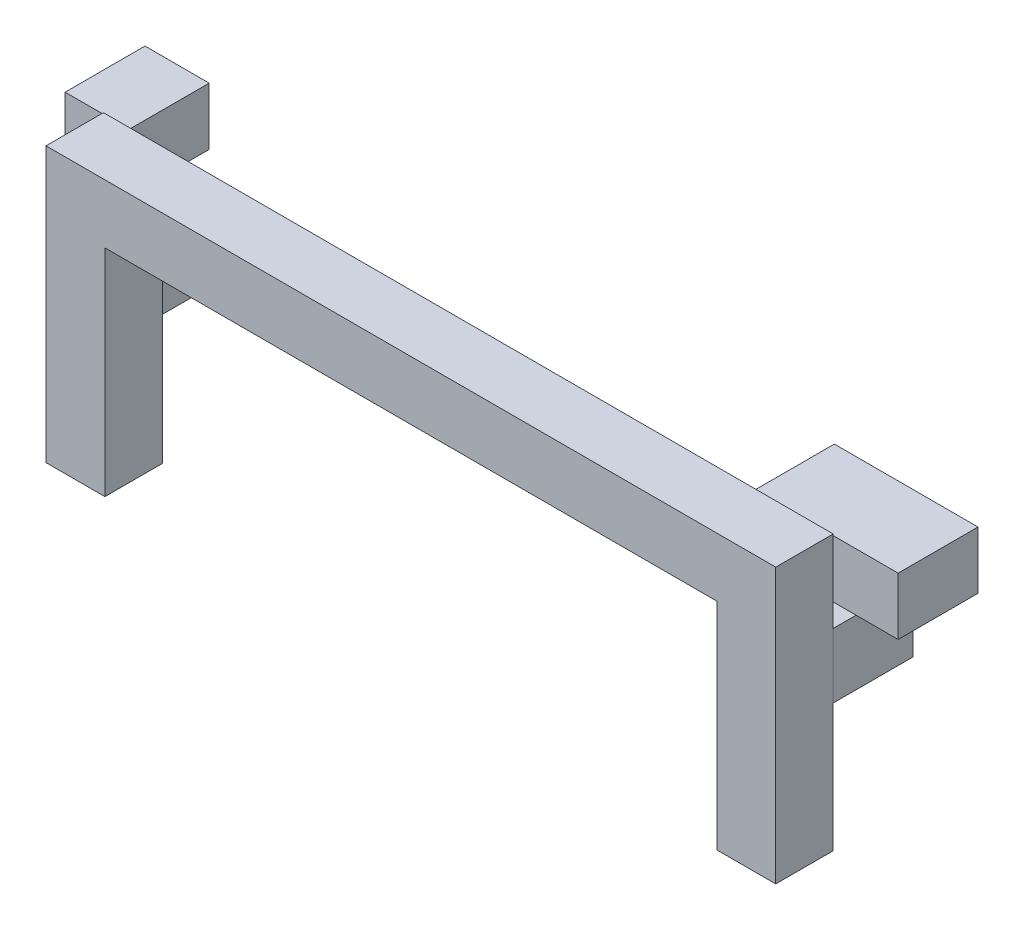
ISO-10303-21;
HEADER;
FILE_DESCRIPTION(('STEP AP214'),'2;1');
FILE_NAME('part.step','',(''),(''),'','','');
FILE_SCHEMA(('AUTOMOTIVE_DESIGN { 1 0 10303 214 1 1 1 1 }'));
ENDSEC;
DATA;
#1=APPLICATION_CONTEXT('core data for automotive mechanical design processes');
#2=APPLICATION_PROTOCOL_DEFINITION('international standard','automotive_design',2000,#1);
#3=PRODUCT_CONTEXT('',#1,'mechanical');
#4=PRODUCT('Part','Part','',(#3));
#5=PRODUCT_RELATED_PRODUCT_CATEGORY('part','',(#4));
#6=PRODUCT_DEFINITION_FORMATION('','',#4);
#7=PRODUCT_DEFINITION_CONTEXT('part definition',#1,'design');
#8=PRODUCT_DEFINITION('design','',#6,#7);
#9=PRODUCT_DEFINITION_SHAPE('','',#8);
#10=(LENGTH_UNIT() NAMED_UNIT(*) SI_UNIT(.MILLI.,.METRE.));
#11=(NAMED_UNIT(*) PLANE_ANGLE_UNIT() SI_UNIT($,.RADIAN.));
#12=(NAMED_UNIT(*) SI_UNIT($,.STERADIAN.) SOLID_ANGLE_UNIT());
#13=UNCERTAINTY_MEASURE_WITH_UNIT(LENGTH_MEASURE(1.E-05),#10,'distance_accuracy_value','');
#14=(GEOMETRIC_REPRESENTATION_CONTEXT(3) GLOBAL_UNCERTAINTY_ASSIGNED_CONTEXT((#13)) GLOBAL_UNIT_ASSIGNED_CONTEXT((#10,
#11,#12)) REPRESENTATION_CONTEXT('',''));
#15=CARTESIAN_POINT('',(0.,0.,0.));
#16=DIRECTION('',(0.,0.,1.));
#17=DIRECTION('',(1.,0.,0.));
#18=AXIS2_PLACEMENT_3D('',#15,#16,#17);
#19=CARTESIAN_POINT('',(0.,0.,0.));
#20=DIRECTION('',(0.,0.,1.));
#21=DIRECTION('',(1.,0.,0.));
#22=AXIS2_PLACEMENT_3D('',#19,#20,#21);
#23=PLANE('',#22);
#24=DIRECTION('',(0.,1.,0.));
#25=VECTOR('',#24,1.);
#26=CARTESIAN_POINT('',(84.4643859649122,-11.0964912280702,0.));
#27=LINE('',#26,#25);
#28=CARTESIAN_POINT('',(84.4643859649122,-51.0964912280702,0.));
#29=VERTEX_POINT('',#28);
#30=CARTESIAN_POINT('',(84.4643859649122,-11.0964912280702,0.));
#31=VERTEX_POINT('',#30);
#32=EDGE_CURVE('E356',#29,#31,#27,.T.);
#33=ORIENTED_EDGE('',*,*,#32,.F.);
#34=DIRECTION('',(1.,0.,0.));
#35=VECTOR('',#34,1.);
#36=CARTESIAN_POINT('',(0.,-51.0964912280702,0.));
#37=LINE('',#36,#35);
#38=CARTESIAN_POINT('',(-327.745614035088,-51.0964912280702,0.));
#39=VERTEX_POINT('',#38);
#40=EDGE_CURVE('E418',#39,#29,#37,.T.);
#41=ORIENTED_EDGE('',*,*,#40,.F.);
#42=DIRECTION('',(0.,1.,0.));
#43=VECTOR('',#42,1.);
#44=CARTESIAN_POINT('',(-327.745614035088,-201.09649122807,0.));
#45=LINE('',#44,#43);
#46=CARTESIAN_POINT('',(-327.745614035088,-201.09649122807,0.));
#47=VERTEX_POINT('',#46);
#48=EDGE_CURVE('E311',#47,#39,#45,.T.);
#49=ORIENTED_EDGE('',*,*,#48,.F.);
#50=DIRECTION('',(1.,0.,0.));
#51=VECTOR('',#50,1.);
#52=CARTESIAN_POINT('',(-368.745614035088,-201.09649122807,0.));
#53=LINE('',#52,#51);
#54=CARTESIAN_POINT('',(-368.745614035088,-201.09649122807,0.));
#55=VERTEX_POINT('',#54);
#56=EDGE_CURVE('E298',#55,#47,#53,.T.);
#57=ORIENTED_EDGE('',*,*,#56,.F.);
#58=DIRECTION('',(0.,1.,0.));
#59=VECTOR('',#58,1.);
#60=CARTESIAN_POINT('',(-368.745614035088,-201.09649122807,0.));
#61=LINE('',#60,#59);
#62=CARTESIAN_POINT('',(-368.745614035088,-51.0964912280702,0.));
#63=VERTEX_POINT('',#62);
#64=EDGE_CURVE('E313',#55,#63,#61,.T.);
#65=ORIENTED_EDGE('',*,*,#64,.T.);
#66=DIRECTION('',(1.,0.,0.));
#67=VECTOR('',#66,1.);
#68=CARTESIAN_POINT('',(-368.745614035088,-51.0964912280702,0.));
#69=LINE('',#68,#67);
#70=CARTESIAN_POINT('',(-350.745614035088,-51.0964912280702,0.));
#71=VERTEX_POINT('',#70);
#72=EDGE_CURVE('E294',#63,#71,#69,.T.);
#73=ORIENTED_EDGE('',*,*,#72,.T.);
#74=DIRECTION('',(0.,1.,0.));
#75=VECTOR('',#74,1.);
#76=CARTESIAN_POINT('',(-350.745614035088,-51.0964912280702,0.));
#77=LINE('',#76,#75);
#78=CARTESIAN_POINT('',(-350.745614035088,-11.0964912280702,0.));
#79=VERTEX_POINT('',#78);
#80=EDGE_CURVE('E373',#71,#79,#77,.T.);
#81=ORIENTED_EDGE('',*,*,#80,.T.);
#82=DIRECTION('',(1.,0.,0.));
#83=VECTOR('',#82,1.);
#84=CARTESIAN_POINT('',(0.,-11.0964912280702,0.));
#85=LINE('',#84,#83);
#86=CARTESIAN_POINT('',(-368.745614035088,-11.0964912280702,0.));
#87=VERTEX_POINT('',#86);
#88=EDGE_CURVE('E12',#87,#79,#85,.T.);
#89=ORIENTED_EDGE('',*,*,#88,.F.);
#90=DIRECTION('',(0.,-1.,0.));
#91=VECTOR('',#90,1.);
#92=CARTESIAN_POINT('',(-368.745614035088,0.,0.));
#93=LINE('',#92,#91);
#94=CARTESIAN_POINT('',(-368.745614035088,-10.0964912280702,0.));
#95=VERTEX_POINT('',#94);
#96=EDGE_CURVE('E415',#95,#87,#93,.T.);
#97=ORIENTED_EDGE('',*,*,#96,.F.);
#98=DIRECTION('',(1.,0.,0.));
#99=VECTOR('',#98,1.);
#100=CARTESIAN_POINT('',(0.,-10.0964912280702,0.));
#101=LINE('',#100,#99);
#102=CARTESIAN_POINT('',(139.254385964912,-10.0964912280702,0.));
#103=VERTEX_POINT('',#102);
#104=EDGE_CURVE('E407',#95,#103,#101,.T.);
#105=ORIENTED_EDGE('',*,*,#104,.T.);
#106=DIRECTION('',(0.,-1.,0.));
#107=VECTOR('',#106,1.);
#108=CARTESIAN_POINT('',(139.254385964912,0.,0.));
#109=LINE('',#108,#107);
#110=CARTESIAN_POINT('',(139.254385964912,-11.0964912280702,0.));
#111=VERTEX_POINT('',#110);
#112=EDGE_CURVE('E421',#103,#111,#109,.T.);
#113=ORIENTED_EDGE('',*,*,#112,.T.);
#114=DIRECTION('',(1.,0.,0.));
#115=VECTOR('',#114,1.);
#116=CARTESIAN_POINT('',(184.464385964912,-11.0964912280702,0.));
#117=LINE('',#116,#115);
#118=EDGE_CURVE('E344',#31,#111,#117,.T.);
#119=ORIENTED_EDGE('',*,*,#118,.F.);
#120=EDGE_LOOP('',(#33,#41,#49,#57,#65,#73,#81,#89,#97,#105,#113,#119));
#121=FACE_BOUND('',#120,.T.);
#122=DIRECTION('',(0.,-1.,0.));
#123=VECTOR('',#122,1.);
#124=CARTESIAN_POINT('',(-328.645614035088,-67.1420576980702,0.));
#125=LINE('',#124,#123);
#126=CARTESIAN_POINT('',(-328.645614035088,-67.1420576980702,0.));
#127=VERTEX_POINT('',#126);
#128=CARTESIAN_POINT('',(-328.645614035088,-112.14205769807,0.));
#129=VERTEX_POINT('',#128);
#130=EDGE_CURVE('E255',#127,#129,#125,.T.);
#131=ORIENTED_EDGE('',*,*,#130,.F.);
#132=DIRECTION('',(1.,0.,0.));
#133=VECTOR('',#132,1.);
#134=CARTESIAN_POINT('',(-328.645614035088,-67.1420576980702,0.));
#135=LINE('',#134,#133);
#136=CARTESIAN_POINT('',(-368.645614035088,-67.1420576980702,0.));
#137=VERTEX_POINT('',#136);
#138=EDGE_CURVE('E252',#137,#127,#135,.T.);
#139=ORIENTED_EDGE('',*,*,#138,.F.);
#140=DIRECTION('',(0.,1.,0.));
#141=VECTOR('',#140,1.);
#142=CARTESIAN_POINT('',(-368.645614035088,-67.1420576980702,0.));
#143=LINE('',#142,#141);
#144=CARTESIAN_POINT('',(-368.645614035088,-112.14205769807,0.));
#145=VERTEX_POINT('',#144);
#146=EDGE_CURVE('E82',#145,#137,#143,.T.);
#147=ORIENTED_EDGE('',*,*,#146,.F.);
#148=DIRECTION('',(-1.,0.,0.));
#149=VECTOR('',#148,1.);
#150=CARTESIAN_POINT('',(-328.645614035088,-112.14205769807,0.));
#151=LINE('',#150,#149);
#152=EDGE_CURVE('E77',#129,#145,#151,.T.);
#153=ORIENTED_EDGE('',*,*,#152,.F.);
#154=EDGE_LOOP('',(#131,#139,#147,#153));
#155=FACE_BOUND('',#154,.T.);
#156=ADVANCED_FACE('F60',(#121,#155),#23,.F.);
#157=CARTESIAN_POINT('',(139.254385964912,-201.09649122807,0.));
#158=DIRECTION('',(0.,0.,1.));
#159=DIRECTION('',(1.,0.,0.));
#160=AXIS2_PLACEMENT_3D('',#157,#158,#159);
#161=PLANE('',#160);
#162=DIRECTION('',(1.,0.,0.));
#163=VECTOR('',#162,1.);
#164=CARTESIAN_POINT('',(139.254385964912,-51.0964912280702,0.));
#165=LINE('',#164,#163);
#166=CARTESIAN_POINT('',(98.2543859649123,-51.0964912280702,0.));
#167=VERTEX_POINT('',#166);
#168=CARTESIAN_POINT('',(139.254385964912,-51.0964912280702,0.));
#169=VERTEX_POINT('',#168);
#170=EDGE_CURVE('E320',#167,#169,#165,.T.);
#171=ORIENTED_EDGE('',*,*,#170,.T.);
#172=DIRECTION('',(0.,1.,0.));
#173=VECTOR('',#172,1.);
#174=CARTESIAN_POINT('',(139.254385964912,-201.09649122807,0.));
#175=LINE('',#174,#173);
#176=CARTESIAN_POINT('',(139.254385964912,-201.09649122807,0.));
#177=VERTEX_POINT('',#176);
#178=EDGE_CURVE('E326',#177,#169,#175,.T.);
#179=ORIENTED_EDGE('',*,*,#178,.F.);
#180=DIRECTION('',(1.,0.,0.));
#181=VECTOR('',#180,1.);
#182=CARTESIAN_POINT('',(139.254385964912,-201.09649122807,0.));
#183=LINE('',#182,#181);
#184=CARTESIAN_POINT('',(98.2543859649123,-201.09649122807,0.));
#185=VERTEX_POINT('',#184);
#186=EDGE_CURVE('E324',#185,#177,#183,.T.);
#187=ORIENTED_EDGE('',*,*,#186,.F.);
#188=DIRECTION('',(0.,1.,0.));
#189=VECTOR('',#188,1.);
#190=CARTESIAN_POINT('',(98.2543859649123,-201.09649122807,0.));
#191=LINE('',#190,#189);
#192=EDGE_CURVE('E333',#185,#167,#191,.T.);
#193=ORIENTED_EDGE('',*,*,#192,.T.);
#194=EDGE_LOOP('',(#171,#179,#187,#193));
#195=FACE_BOUND('',#194,.T.);
#196=DIRECTION('',(0.,-1.,0.));
#197=VECTOR('',#196,1.);
#198=CARTESIAN_POINT('',(139.154385964912,-67.1420576980702,0.));
#199=LINE('',#198,#197);
#200=CARTESIAN_POINT('',(139.154385964912,-67.1420576980702,0.));
#201=VERTEX_POINT('',#200);
#202=CARTESIAN_POINT('',(139.154385964912,-112.14205769807,0.));
#203=VERTEX_POINT('',#202);
#204=EDGE_CURVE('E256',#201,#203,#199,.T.);
#205=ORIENTED_EDGE('',*,*,#204,.F.);
#206=DIRECTION('',(1.,0.,0.));
#207=VECTOR('',#206,1.);
#208=CARTESIAN_POINT('',(139.154385964912,-67.1420576980702,0.));
#209=LINE('',#208,#207);
#210=CARTESIAN_POINT('',(99.1543859649123,-67.1420576980702,0.));
#211=VERTEX_POINT('',#210);
#212=EDGE_CURVE('E269',#211,#201,#209,.T.);
#213=ORIENTED_EDGE('',*,*,#212,.F.);
#214=DIRECTION('',(0.,1.,0.));
#215=VECTOR('',#214,1.);
#216=CARTESIAN_POINT('',(99.1543859649123,-67.1420576980702,0.));
#217=LINE('',#216,#215);
#218=CARTESIAN_POINT('',(99.1543859649123,-112.14205769807,0.));
#219=VERTEX_POINT('',#218);
#220=EDGE_CURVE('E278',#219,#211,#217,.T.);
#221=ORIENTED_EDGE('',*,*,#220,.F.);
#222=DIRECTION('',(-1.,0.,0.));
#223=VECTOR('',#222,1.);
#224=CARTESIAN_POINT('',(139.154385964912,-112.14205769807,0.));
#225=LINE('',#224,#223);
#226=EDGE_CURVE('E259',#203,#219,#225,.T.);
#227=ORIENTED_EDGE('',*,*,#226,.F.);
#228=EDGE_LOOP('',(#205,#213,#221,#227));
#229=FACE_BOUND('',#228,.T.);
#230=ADVANCED_FACE('F477',(#195,#229),#161,.F.);
#231=CARTESIAN_POINT('',(0.,-51.0964912280702,40.));
#232=DIRECTION('',(0.,1.,0.));
#233=DIRECTION('',(0.,0.,1.));
#234=AXIS2_PLACEMENT_3D('',#231,#232,#233);
#235=PLANE('',#234);
#236=ORIENTED_EDGE('',*,*,#72,.F.);
#237=DIRECTION('',(1.,0.,0.));
#238=VECTOR('',#237,1.);
#239=CARTESIAN_POINT('',(0.,-51.0964912280702,0.));
#240=LINE('',#239,#238);
#241=CARTESIAN_POINT('',(-395.435614035088,-51.0964912280702,0.));
#242=VERTEX_POINT('',#241);
#243=EDGE_CURVE('E378',#242,#63,#240,.T.);
#244=ORIENTED_EDGE('',*,*,#243,.F.);
#245=DIRECTION('',(0.,0.,1.));
#246=VECTOR('',#245,1.);
#247=CARTESIAN_POINT('',(-395.435614035088,-51.0964912280702,-55.6));
#248=LINE('',#247,#246);
#249=CARTESIAN_POINT('',(-395.435614035088,-51.0964912280702,-55.6));
#250=VERTEX_POINT('',#249);
#251=EDGE_CURVE('E382',#250,#242,#248,.T.);
#252=ORIENTED_EDGE('',*,*,#251,.F.);
#253=DIRECTION('',(1.,0.,0.));
#254=VECTOR('',#253,1.);
#255=CARTESIAN_POINT('',(0.,-51.0964912280702,-55.6));
#256=LINE('',#255,#254);
#257=CARTESIAN_POINT('',(-350.745614035088,-51.0964912280702,-55.6));
#258=VERTEX_POINT('',#257);
#259=EDGE_CURVE('E380',#250,#258,#256,.T.);
#260=ORIENTED_EDGE('',*,*,#259,.T.);
#261=DIRECTION('',(0.,0.,1.));
#262=VECTOR('',#261,1.);
#263=CARTESIAN_POINT('',(-350.745614035088,-51.0964912280702,-55.6));
#264=LINE('',#263,#262);
#265=EDGE_CURVE('E398',#258,#71,#264,.T.);
#266=ORIENTED_EDGE('',*,*,#265,.T.);
#267=EDGE_LOOP('',(#236,#244,#252,#260,#266));
#268=FACE_BOUND('',#267,.T.);
#269=ADVANCED_FACE('F455',(#268),#235,.F.);
#270=DIRECTION('',(0.,0.,1.));
#271=VECTOR('',#270,1.);
#272=CARTESIAN_POINT('',(-327.745614035088,-51.0964912280702,0.));
#273=LINE('',#272,#271);
#274=CARTESIAN_POINT('',(-327.745614035088,-51.0964912280702,40.));
#275=VERTEX_POINT('',#274);
#276=EDGE_CURVE('E299',#39,#275,#273,.T.);
#277=ORIENTED_EDGE('',*,*,#276,.F.);
#278=ORIENTED_EDGE('',*,*,#40,.T.);
#279=DIRECTION('',(0.,0.,1.));
#280=VECTOR('',#279,1.);
#281=CARTESIAN_POINT('',(84.4643859649122,-51.0964912280702,-55.6));
#282=LINE('',#281,#280);
#283=CARTESIAN_POINT('',(84.4643859649122,-51.0964912280702,-55.6));
#284=VERTEX_POINT('',#283);
#285=EDGE_CURVE('E367',#284,#29,#282,.T.);
#286=ORIENTED_EDGE('',*,*,#285,.F.);
#287=DIRECTION('',(-1.,0.,0.));
#288=VECTOR('',#287,1.);
#289=CARTESIAN_POINT('',(184.464385964912,-51.0964912280702,-55.6));
#290=LINE('',#289,#288);
#291=CARTESIAN_POINT('',(184.464385964912,-51.0964912280702,-55.6));
#292=VERTEX_POINT('',#291);
#293=EDGE_CURVE('E343',#292,#284,#290,.T.);
#294=ORIENTED_EDGE('',*,*,#293,.F.);
#295=DIRECTION('',(0.,0.,1.));
#296=VECTOR('',#295,1.);
#297=CARTESIAN_POINT('',(184.464385964912,-51.0964912280702,-55.6));
#298=LINE('',#297,#296);
#299=CARTESIAN_POINT('',(184.464385964912,-51.0964912280702,0.));
#300=VERTEX_POINT('',#299);
#301=EDGE_CURVE('E370',#292,#300,#298,.T.);
#302=ORIENTED_EDGE('',*,*,#301,.T.);
#303=DIRECTION('',(-1.,0.,0.));
#304=VECTOR('',#303,1.);
#305=CARTESIAN_POINT('',(184.464385964912,-51.0964912280702,0.));
#306=LINE('',#305,#304);
#307=EDGE_CURVE('E353',#300,#169,#306,.T.);
#308=ORIENTED_EDGE('',*,*,#307,.T.);
#309=ORIENTED_EDGE('',*,*,#170,.F.);
#310=DIRECTION('',(0.,0.,-1.));
#311=VECTOR('',#310,1.);
#312=CARTESIAN_POINT('',(98.2543859649123,-51.0964912280702,0.));
#313=LINE('',#312,#311);
#314=CARTESIAN_POINT('',(98.2543859649123,-51.0964912280702,40.));
#315=VERTEX_POINT('',#314);
#316=EDGE_CURVE('E315',#315,#167,#313,.T.);
#317=ORIENTED_EDGE('',*,*,#316,.F.);
#318=DIRECTION('',(1.,0.,0.));
#319=VECTOR('',#318,1.);
#320=CARTESIAN_POINT('',(0.,-51.0964912280702,40.));
#321=LINE('',#320,#319);
#322=EDGE_CURVE('E406',#275,#315,#321,.T.);
#323=ORIENTED_EDGE('',*,*,#322,.F.);
#324=EDGE_LOOP('',(#277,#278,#286,#294,#302,#308,#309,#317,#323));
#325=FACE_BOUND('',#324,.T.);
#326=ADVANCED_FACE('F482',(#325),#235,.F.);
#327=CARTESIAN_POINT('',(-368.745614035088,0.,40.));
#328=DIRECTION('',(1.,0.,0.));
#329=DIRECTION('',(0.,0.,-1.));
#330=AXIS2_PLACEMENT_3D('',#327,#328,#329);
#331=PLANE('',#330);
#332=ORIENTED_EDGE('',*,*,#96,.T.);
#333=EDGE_CURVE('E394',#87,#63,#93,.T.);
#334=ORIENTED_EDGE('',*,*,#333,.T.);
#335=ORIENTED_EDGE('',*,*,#64,.F.);
#336=DIRECTION('',(0.,0.,-1.));
#337=VECTOR('',#336,1.);
#338=CARTESIAN_POINT('',(-368.745614035088,-201.09649122807,0.));
#339=LINE('',#338,#337);
#340=CARTESIAN_POINT('',(-368.745614035088,-201.09649122807,40.));
#341=VERTEX_POINT('',#340);
#342=EDGE_CURVE('E295',#341,#55,#339,.T.);
#343=ORIENTED_EDGE('',*,*,#342,.F.);
#344=DIRECTION('',(0.,-1.,0.));
#345=VECTOR('',#344,1.);
#346=CARTESIAN_POINT('',(-368.745614035088,0.,40.));
#347=LINE('',#346,#345);
#348=CARTESIAN_POINT('',(-368.745614035088,-10.0964912280702,40.));
#349=VERTEX_POINT('',#348);
#350=EDGE_CURVE('E404',#349,#341,#347,.T.);
#351=ORIENTED_EDGE('',*,*,#350,.F.);
#352=DIRECTION('',(0.,0.,-1.));
#353=VECTOR('',#352,1.);
#354=CARTESIAN_POINT('',(-368.745614035088,-10.0964912280702,40.));
#355=LINE('',#354,#353);
#356=EDGE_CURVE('E414',#349,#95,#355,.T.);
#357=ORIENTED_EDGE('',*,*,#356,.T.);
#358=EDGE_LOOP('',(#332,#334,#335,#343,#351,#357));
#359=FACE_BOUND('',#358,.T.);
#360=ADVANCED_FACE('F62',(#359),#331,.F.);
#361=CARTESIAN_POINT('',(139.254385964912,0.,40.));
#362=DIRECTION('',(1.,0.,0.));
#363=DIRECTION('',(0.,0.,-1.));
#364=AXIS2_PLACEMENT_3D('',#361,#362,#363);
#365=PLANE('',#364);
#366=ORIENTED_EDGE('',*,*,#112,.F.);
#367=DIRECTION('',(0.,0.,-1.));
#368=VECTOR('',#367,1.);
#369=CARTESIAN_POINT('',(139.254385964912,-10.0964912280702,40.));
#370=LINE('',#369,#368);
#371=CARTESIAN_POINT('',(139.254385964912,-10.0964912280702,40.));
#372=VERTEX_POINT('',#371);
#373=EDGE_CURVE('E64',#372,#103,#370,.T.);
#374=ORIENTED_EDGE('',*,*,#373,.F.);
#375=DIRECTION('',(0.,-1.,0.));
#376=VECTOR('',#375,1.);
#377=CARTESIAN_POINT('',(139.254385964912,0.,40.));
#378=LINE('',#377,#376);
#379=CARTESIAN_POINT('',(139.254385964912,-201.09649122807,40.));
#380=VERTEX_POINT('',#379);
#381=EDGE_CURVE('E409',#372,#380,#378,.T.);
#382=ORIENTED_EDGE('',*,*,#381,.T.);
#383=DIRECTION('',(0.,0.,1.));
#384=VECTOR('',#383,1.);
#385=CARTESIAN_POINT('',(139.254385964912,-201.09649122807,0.));
#386=LINE('',#385,#384);
#387=EDGE_CURVE('E316',#177,#380,#386,.T.);
#388=ORIENTED_EDGE('',*,*,#387,.F.);
#389=ORIENTED_EDGE('',*,*,#178,.T.);
#390=EDGE_CURVE('E420',#111,#169,#109,.T.);
#391=ORIENTED_EDGE('',*,*,#390,.F.);
#392=EDGE_LOOP('',(#366,#374,#382,#388,#389,#391));
#393=FACE_BOUND('',#392,.T.);
#394=ADVANCED_FACE('F435',(#393),#365,.T.);
#395=CARTESIAN_POINT('',(0.,-10.0964912280702,40.));
#396=DIRECTION('',(0.,1.,0.));
#397=DIRECTION('',(0.,0.,1.));
#398=AXIS2_PLACEMENT_3D('',#395,#396,#397);
#399=PLANE('',#398);
#400=ORIENTED_EDGE('',*,*,#104,.F.);
#401=ORIENTED_EDGE('',*,*,#356,.F.);
#402=DIRECTION('',(1.,0.,0.));
#403=VECTOR('',#402,1.);
#404=CARTESIAN_POINT('',(0.,-10.0964912280702,40.));
#405=LINE('',#404,#403);
#406=EDGE_CURVE('E411',#349,#372,#405,.T.);
#407=ORIENTED_EDGE('',*,*,#406,.T.);
#408=ORIENTED_EDGE('',*,*,#373,.T.);
#409=EDGE_LOOP('',(#400,#401,#407,#408));
#410=FACE_BOUND('',#409,.T.);
#411=ADVANCED_FACE('F430',(#410),#399,.T.);
#412=CARTESIAN_POINT('',(0.,0.,40.));
#413=DIRECTION('',(0.,0.,1.));
#414=DIRECTION('',(1.,0.,0.));
#415=AXIS2_PLACEMENT_3D('',#412,#413,#414);
#416=PLANE('',#415);
#417=ORIENTED_EDGE('',*,*,#350,.T.);
#418=DIRECTION('',(-1.,0.,0.));
#419=VECTOR('',#418,1.);
#420=CARTESIAN_POINT('',(-368.745614035088,-201.09649122807,40.));
#421=LINE('',#420,#419);
#422=CARTESIAN_POINT('',(-327.745614035088,-201.09649122807,40.));
#423=VERTEX_POINT('',#422);
#424=EDGE_CURVE('E303',#423,#341,#421,.T.);
#425=ORIENTED_EDGE('',*,*,#424,.F.);
#426=DIRECTION('',(0.,1.,0.));
#427=VECTOR('',#426,1.);
#428=CARTESIAN_POINT('',(-327.745614035088,-201.09649122807,40.));
#429=LINE('',#428,#427);
#430=EDGE_CURVE('E306',#423,#275,#429,.T.);
#431=ORIENTED_EDGE('',*,*,#430,.T.);
#432=ORIENTED_EDGE('',*,*,#322,.T.);
#433=DIRECTION('',(0.,1.,0.));
#434=VECTOR('',#433,1.);
#435=CARTESIAN_POINT('',(98.2543859649123,-201.09649122807,40.));
#436=LINE('',#435,#434);
#437=CARTESIAN_POINT('',(98.2543859649123,-201.09649122807,40.));
#438=VERTEX_POINT('',#437);
#439=EDGE_CURVE('E336',#438,#315,#436,.T.);
#440=ORIENTED_EDGE('',*,*,#439,.F.);
#441=DIRECTION('',(-1.,0.,0.));
#442=VECTOR('',#441,1.);
#443=CARTESIAN_POINT('',(139.254385964912,-201.09649122807,40.));
#444=LINE('',#443,#442);
#445=EDGE_CURVE('E319',#380,#438,#444,.T.);
#446=ORIENTED_EDGE('',*,*,#445,.F.);
#447=ORIENTED_EDGE('',*,*,#381,.F.);
#448=ORIENTED_EDGE('',*,*,#406,.F.);
#449=EDGE_LOOP('',(#417,#425,#431,#432,#440,#446,#447,#448));
#450=FACE_BOUND('',#449,.T.);
#451=ADVANCED_FACE('F466',(#450),#416,.T.);
#452=CARTESIAN_POINT('',(0.,0.,0.));
#453=DIRECTION('',(0.,0.,-1.));
#454=DIRECTION('',(-1.,0.,0.));
#455=AXIS2_PLACEMENT_3D('',#452,#453,#454);
#456=PLANE('',#455);
#457=ORIENTED_EDGE('',*,*,#333,.F.);
#458=CARTESIAN_POINT('',(-395.435614035088,-11.0964912280702,0.));
#459=VERTEX_POINT('',#458);
#460=EDGE_CURVE('E70',#459,#87,#85,.T.);
#461=ORIENTED_EDGE('',*,*,#460,.F.);
#462=DIRECTION('',(0.,1.,0.));
#463=VECTOR('',#462,1.);
#464=CARTESIAN_POINT('',(-395.435614035088,-5.48777154323177E-13,0.));
#465=LINE('',#464,#463);
#466=EDGE_CURVE('E383',#242,#459,#465,.T.);
#467=ORIENTED_EDGE('',*,*,#466,.F.);
#468=ORIENTED_EDGE('',*,*,#243,.T.);
#469=EDGE_LOOP('',(#457,#461,#467,#468));
#470=FACE_BOUND('',#469,.T.);
#471=ADVANCED_FACE('F443',(#470),#456,.F.);
#472=CARTESIAN_POINT('',(-395.435614035088,-5.48777154323177E-13,-55.6));
#473=DIRECTION('',(1.,0.,0.));
#474=DIRECTION('',(0.,1.,0.));
#475=AXIS2_PLACEMENT_3D('',#472,#473,#474);
#476=PLANE('',#475);
#477=ORIENTED_EDGE('',*,*,#466,.T.);
#478=DIRECTION('',(0.,0.,1.));
#479=VECTOR('',#478,1.);
#480=CARTESIAN_POINT('',(-395.435614035088,-11.0964912280702,-55.6));
#481=LINE('',#480,#479);
#482=CARTESIAN_POINT('',(-395.435614035088,-11.0964912280702,-55.6));
#483=VERTEX_POINT('',#482);
#484=EDGE_CURVE('E391',#483,#459,#481,.T.);
#485=ORIENTED_EDGE('',*,*,#484,.F.);
#486=DIRECTION('',(0.,1.,0.));
#487=VECTOR('',#486,1.);
#488=CARTESIAN_POINT('',(-395.435614035088,-5.48777154323177E-13,-55.6));
#489=LINE('',#488,#487);
#490=EDGE_CURVE('E374',#250,#483,#489,.T.);
#491=ORIENTED_EDGE('',*,*,#490,.F.);
#492=ORIENTED_EDGE('',*,*,#251,.T.);
#493=EDGE_LOOP('',(#477,#485,#491,#492));
#494=FACE_BOUND('',#493,.T.);
#495=ADVANCED_FACE('F452',(#494),#476,.F.);
#496=CARTESIAN_POINT('',(0.,-11.0964912280702,-55.6));
#497=DIRECTION('',(0.,-1.,0.));
#498=DIRECTION('',(1.,0.,0.));
#499=AXIS2_PLACEMENT_3D('',#496,#497,#498);
#500=PLANE('',#499);
#501=ORIENTED_EDGE('',*,*,#460,.T.);
#502=ORIENTED_EDGE('',*,*,#88,.T.);
#503=DIRECTION('',(0.,0.,1.));
#504=VECTOR('',#503,1.);
#505=CARTESIAN_POINT('',(-350.745614035088,-11.0964912280702,-55.6));
#506=LINE('',#505,#504);
#507=CARTESIAN_POINT('',(-350.745614035088,-11.0964912280702,-55.6));
#508=VERTEX_POINT('',#507);
#509=EDGE_CURVE('E385',#508,#79,#506,.T.);
#510=ORIENTED_EDGE('',*,*,#509,.F.);
#511=DIRECTION('',(1.,0.,0.));
#512=VECTOR('',#511,1.);
#513=CARTESIAN_POINT('',(0.,-11.0964912280702,-55.6));
#514=LINE('',#513,#512);
#515=EDGE_CURVE('E377',#483,#508,#514,.T.);
#516=ORIENTED_EDGE('',*,*,#515,.F.);
#517=ORIENTED_EDGE('',*,*,#484,.T.);
#518=EDGE_LOOP('',(#501,#502,#510,#516,#517));
#519=FACE_BOUND('',#518,.T.);
#520=ADVANCED_FACE('F447',(#519),#500,.F.);
#521=CARTESIAN_POINT('',(0.,0.,-55.6));
#522=DIRECTION('',(0.,0.,-1.));
#523=DIRECTION('',(-1.,0.,0.));
#524=AXIS2_PLACEMENT_3D('',#521,#522,#523);
#525=PLANE('',#524);
#526=ORIENTED_EDGE('',*,*,#490,.T.);
#527=ORIENTED_EDGE('',*,*,#515,.T.);
#528=DIRECTION('',(0.,1.,0.));
#529=VECTOR('',#528,1.);
#530=CARTESIAN_POINT('',(-350.745614035088,-51.0964912280702,-55.6));
#531=LINE('',#530,#529);
#532=EDGE_CURVE('E395',#258,#508,#531,.T.);
#533=ORIENTED_EDGE('',*,*,#532,.F.);
#534=ORIENTED_EDGE('',*,*,#259,.F.);
#535=EDGE_LOOP('',(#526,#527,#533,#534));
#536=FACE_BOUND('',#535,.T.);
#537=ADVANCED_FACE('F568',(#536),#525,.T.);
#538=CARTESIAN_POINT('',(-350.745614035088,-51.0964912280702,-55.6));
#539=DIRECTION('',(1.,0.,0.));
#540=DIRECTION('',(0.,1.,0.));
#541=AXIS2_PLACEMENT_3D('',#538,#539,#540);
#542=PLANE('',#541);
#543=ORIENTED_EDGE('',*,*,#80,.F.);
#544=ORIENTED_EDGE('',*,*,#265,.F.);
#545=ORIENTED_EDGE('',*,*,#532,.T.);
#546=ORIENTED_EDGE('',*,*,#509,.T.);
#547=EDGE_LOOP('',(#543,#544,#545,#546));
#548=FACE_BOUND('',#547,.T.);
#549=ADVANCED_FACE('F575',(#548),#542,.T.);
#550=CARTESIAN_POINT('',(184.464385964912,-11.0964912280702,-55.6));
#551=DIRECTION('',(-1.,0.,0.));
#552=DIRECTION('',(0.,0.,1.));
#553=AXIS2_PLACEMENT_3D('',#550,#551,#552);
#554=PLANE('',#553);
#555=DIRECTION('',(0.,-1.,0.));
#556=VECTOR('',#555,1.);
#557=CARTESIAN_POINT('',(184.464385964912,-11.0964912280702,0.));
#558=LINE('',#557,#556);
#559=CARTESIAN_POINT('',(184.464385964912,-11.0964912280702,0.));
#560=VERTEX_POINT('',#559);
#561=EDGE_CURVE('E339',#560,#300,#558,.T.);
#562=ORIENTED_EDGE('',*,*,#561,.T.);
#563=ORIENTED_EDGE('',*,*,#301,.F.);
#564=DIRECTION('',(0.,-1.,0.));
#565=VECTOR('',#564,1.);
#566=CARTESIAN_POINT('',(184.464385964912,-11.0964912280702,-55.6));
#567=LINE('',#566,#565);
#568=CARTESIAN_POINT('',(184.464385964912,-11.0964912280702,-55.6));
#569=VERTEX_POINT('',#568);
#570=EDGE_CURVE('E340',#569,#292,#567,.T.);
#571=ORIENTED_EDGE('',*,*,#570,.F.);
#572=DIRECTION('',(0.,0.,1.));
#573=VECTOR('',#572,1.);
#574=CARTESIAN_POINT('',(184.464385964912,-11.0964912280702,-55.6));
#575=LINE('',#574,#573);
#576=EDGE_CURVE('E350',#569,#560,#575,.T.);
#577=ORIENTED_EDGE('',*,*,#576,.T.);
#578=EDGE_LOOP('',(#562,#563,#571,#577));
#579=FACE_BOUND('',#578,.T.);
#580=ADVANCED_FACE('F500',(#579),#554,.F.);
#581=CARTESIAN_POINT('',(84.4643859649122,-11.0964912280702,-55.6));
#582=DIRECTION('',(1.,0.,0.));
#583=DIRECTION('',(0.,0.,-1.));
#584=AXIS2_PLACEMENT_3D('',#581,#582,#583);
#585=PLANE('',#584);
#586=ORIENTED_EDGE('',*,*,#32,.T.);
#587=DIRECTION('',(0.,0.,1.));
#588=VECTOR('',#587,1.);
#589=CARTESIAN_POINT('',(84.4643859649122,-11.0964912280702,-55.6));
#590=LINE('',#589,#588);
#591=CARTESIAN_POINT('',(84.4643859649122,-11.0964912280702,-55.6));
#592=VERTEX_POINT('',#591);
#593=EDGE_CURVE('E364',#592,#31,#590,.T.);
#594=ORIENTED_EDGE('',*,*,#593,.F.);
#595=DIRECTION('',(0.,1.,0.));
#596=VECTOR('',#595,1.);
#597=CARTESIAN_POINT('',(84.4643859649122,-11.0964912280702,-55.6));
#598=LINE('',#597,#596);
#599=EDGE_CURVE('E346',#284,#592,#598,.T.);
#600=ORIENTED_EDGE('',*,*,#599,.F.);
#601=ORIENTED_EDGE('',*,*,#285,.T.);
#602=EDGE_LOOP('',(#586,#594,#600,#601));
#603=FACE_BOUND('',#602,.T.);
#604=ADVANCED_FACE('F492',(#603),#585,.F.);
#605=CARTESIAN_POINT('',(184.464385964912,-11.0964912280702,-55.6));
#606=DIRECTION('',(0.,-1.,0.));
#607=DIRECTION('',(0.,0.,-1.));
#608=AXIS2_PLACEMENT_3D('',#605,#606,#607);
#609=PLANE('',#608);
#610=ORIENTED_EDGE('',*,*,#118,.T.);
#611=EDGE_CURVE('E359',#111,#560,#117,.T.);
#612=ORIENTED_EDGE('',*,*,#611,.T.);
#613=ORIENTED_EDGE('',*,*,#576,.F.);
#614=DIRECTION('',(1.,0.,0.));
#615=VECTOR('',#614,1.);
#616=CARTESIAN_POINT('',(184.464385964912,-11.0964912280702,-55.6));
#617=LINE('',#616,#615);
#618=EDGE_CURVE('E348',#592,#569,#617,.T.);
#619=ORIENTED_EDGE('',*,*,#618,.F.);
#620=ORIENTED_EDGE('',*,*,#593,.T.);
#621=EDGE_LOOP('',(#610,#612,#613,#619,#620));
#622=FACE_BOUND('',#621,.T.);
#623=ADVANCED_FACE('F505',(#622),#609,.F.);
#624=CARTESIAN_POINT('',(0.,0.,-55.6));
#625=DIRECTION('',(0.,0.,-1.));
#626=DIRECTION('',(-1.,0.,0.));
#627=AXIS2_PLACEMENT_3D('',#624,#625,#626);
#628=PLANE('',#627);
#629=ORIENTED_EDGE('',*,*,#570,.T.);
#630=ORIENTED_EDGE('',*,*,#293,.T.);
#631=ORIENTED_EDGE('',*,*,#599,.T.);
#632=ORIENTED_EDGE('',*,*,#618,.T.);
#633=EDGE_LOOP('',(#629,#630,#631,#632));
#634=FACE_BOUND('',#633,.T.);
#635=ADVANCED_FACE('F496',(#634),#628,.T.);
#636=CARTESIAN_POINT('',(0.,0.,0.));
#637=DIRECTION('',(0.,0.,-1.));
#638=DIRECTION('',(-1.,0.,0.));
#639=AXIS2_PLACEMENT_3D('',#636,#637,#638);
#640=PLANE('',#639);
#641=ORIENTED_EDGE('',*,*,#390,.T.);
#642=ORIENTED_EDGE('',*,*,#307,.F.);
#643=ORIENTED_EDGE('',*,*,#561,.F.);
#644=ORIENTED_EDGE('',*,*,#611,.F.);
#645=EDGE_LOOP('',(#641,#642,#643,#644));
#646=FACE_BOUND('',#645,.T.);
#647=ADVANCED_FACE('F503',(#646),#640,.F.);
#648=CARTESIAN_POINT('',(98.2543859649123,-201.09649122807,0.));
#649=DIRECTION('',(1.,0.,0.));
#650=DIRECTION('',(0.,0.,-1.));
#651=AXIS2_PLACEMENT_3D('',#648,#649,#650);
#652=PLANE('',#651);
#653=ORIENTED_EDGE('',*,*,#316,.T.);
#654=ORIENTED_EDGE('',*,*,#192,.F.);
#655=DIRECTION('',(0.,0.,-1.));
#656=VECTOR('',#655,1.);
#657=CARTESIAN_POINT('',(98.2543859649123,-201.09649122807,0.));
#658=LINE('',#657,#656);
#659=EDGE_CURVE('E322',#438,#185,#658,.T.);
#660=ORIENTED_EDGE('',*,*,#659,.F.);
#661=ORIENTED_EDGE('',*,*,#439,.T.);
#662=EDGE_LOOP('',(#653,#654,#660,#661));
#663=FACE_BOUND('',#662,.T.);
#664=ADVANCED_FACE('F485',(#663),#652,.F.);
#665=CARTESIAN_POINT('',(0.,-201.09649122807,0.));
#666=DIRECTION('',(0.,-1.,0.));
#667=DIRECTION('',(0.,0.,-1.));
#668=AXIS2_PLACEMENT_3D('',#665,#666,#667);
#669=PLANE('',#668);
#670=ORIENTED_EDGE('',*,*,#387,.T.);
#671=ORIENTED_EDGE('',*,*,#445,.T.);
#672=ORIENTED_EDGE('',*,*,#659,.T.);
#673=ORIENTED_EDGE('',*,*,#186,.T.);
#674=EDGE_LOOP('',(#670,#671,#672,#673));
#675=FACE_BOUND('',#674,.T.);
#676=ADVANCED_FACE('F472',(#675),#669,.T.);
#677=CARTESIAN_POINT('',(-327.745614035088,-201.09649122807,0.));
#678=DIRECTION('',(-1.,0.,0.));
#679=DIRECTION('',(0.,0.,1.));
#680=AXIS2_PLACEMENT_3D('',#677,#678,#679);
#681=PLANE('',#680);
#682=ORIENTED_EDGE('',*,*,#276,.T.);
#683=ORIENTED_EDGE('',*,*,#430,.F.);
#684=DIRECTION('',(0.,0.,1.));
#685=VECTOR('',#684,1.);
#686=CARTESIAN_POINT('',(-327.745614035088,-201.09649122807,0.));
#687=LINE('',#686,#685);
#688=EDGE_CURVE('E301',#47,#423,#687,.T.);
#689=ORIENTED_EDGE('',*,*,#688,.F.);
#690=ORIENTED_EDGE('',*,*,#48,.T.);
#691=EDGE_LOOP('',(#682,#683,#689,#690));
#692=FACE_BOUND('',#691,.T.);
#693=ADVANCED_FACE('F652',(#692),#681,.F.);
#694=CARTESIAN_POINT('',(0.,-201.09649122807,0.));
#695=DIRECTION('',(0.,1.,0.));
#696=DIRECTION('',(0.,0.,1.));
#697=AXIS2_PLACEMENT_3D('',#694,#695,#696);
#698=PLANE('',#697);
#699=ORIENTED_EDGE('',*,*,#342,.T.);
#700=ORIENTED_EDGE('',*,*,#56,.T.);
#701=ORIENTED_EDGE('',*,*,#688,.T.);
#702=ORIENTED_EDGE('',*,*,#424,.T.);
#703=EDGE_LOOP('',(#699,#700,#701,#702));
#704=FACE_BOUND('',#703,.T.);
#705=ADVANCED_FACE('F461',(#704),#698,.F.);
#706=CARTESIAN_POINT('',(139.154385964912,-67.1420576980702,-55.6));
#707=DIRECTION('',(-1.,0.,0.));
#708=DIRECTION('',(0.,0.,1.));
#709=AXIS2_PLACEMENT_3D('',#706,#707,#708);
#710=PLANE('',#709);
#711=ORIENTED_EDGE('',*,*,#204,.T.);
#712=DIRECTION('',(0.,0.,1.));
#713=VECTOR('',#712,1.);
#714=CARTESIAN_POINT('',(139.154385964912,-112.14205769807,-55.6));
#715=LINE('',#714,#713);
#716=CARTESIAN_POINT('',(139.154385964912,-112.14205769807,-55.6));
#717=VERTEX_POINT('',#716);
#718=EDGE_CURVE('E291',#717,#203,#715,.T.);
#719=ORIENTED_EDGE('',*,*,#718,.F.);
#720=DIRECTION('',(0.,-1.,0.));
#721=VECTOR('',#720,1.);
#722=CARTESIAN_POINT('',(139.154385964912,-67.1420576980702,-55.6));
#723=LINE('',#722,#721);
#724=CARTESIAN_POINT('',(139.154385964912,-67.1420576980702,-55.6));
#725=VERTEX_POINT('',#724);
#726=EDGE_CURVE('E265',#725,#717,#723,.T.);
#727=ORIENTED_EDGE('',*,*,#726,.F.);
#728=DIRECTION('',(0.,0.,1.));
#729=VECTOR('',#728,1.);
#730=CARTESIAN_POINT('',(139.154385964912,-67.1420576980702,-55.6));
#731=LINE('',#730,#729);
#732=EDGE_CURVE('E274',#725,#201,#731,.T.);
#733=ORIENTED_EDGE('',*,*,#732,.T.);
#734=EDGE_LOOP('',(#711,#719,#727,#733));
#735=FACE_BOUND('',#734,.T.);
#736=ADVANCED_FACE('F668',(#735),#710,.F.);
#737=CARTESIAN_POINT('',(139.154385964912,-112.14205769807,-55.6));
#738=DIRECTION('',(0.,1.,0.));
#739=DIRECTION('',(-1.,0.,0.));
#740=AXIS2_PLACEMENT_3D('',#737,#738,#739);
#741=PLANE('',#740);
#742=ORIENTED_EDGE('',*,*,#226,.T.);
#743=DIRECTION('',(0.,0.,1.));
#744=VECTOR('',#743,1.);
#745=CARTESIAN_POINT('',(99.1543859649123,-112.14205769807,-55.6));
#746=LINE('',#745,#744);
#747=CARTESIAN_POINT('',(99.1543859649123,-112.14205769807,-55.6));
#748=VERTEX_POINT('',#747);
#749=EDGE_CURVE('E288',#748,#219,#746,.T.);
#750=ORIENTED_EDGE('',*,*,#749,.F.);
#751=DIRECTION('',(-1.,0.,0.));
#752=VECTOR('',#751,1.);
#753=CARTESIAN_POINT('',(139.154385964912,-112.14205769807,-55.6));
#754=LINE('',#753,#752);
#755=EDGE_CURVE('E268',#717,#748,#754,.T.);
#756=ORIENTED_EDGE('',*,*,#755,.F.);
#757=ORIENTED_EDGE('',*,*,#718,.T.);
#758=EDGE_LOOP('',(#742,#750,#756,#757));
#759=FACE_BOUND('',#758,.T.);
#760=ADVANCED_FACE('F690',(#759),#741,.F.);
#761=CARTESIAN_POINT('',(99.1543859649123,-67.1420576980702,-55.6));
#762=DIRECTION('',(1.,0.,0.));
#763=DIRECTION('',(0.,0.,-1.));
#764=AXIS2_PLACEMENT_3D('',#761,#762,#763);
#765=PLANE('',#764);
#766=ORIENTED_EDGE('',*,*,#220,.T.);
#767=DIRECTION('',(0.,0.,1.));
#768=VECTOR('',#767,1.);
#769=CARTESIAN_POINT('',(99.1543859649123,-67.1420576980702,-55.6));
#770=LINE('',#769,#768);
#771=CARTESIAN_POINT('',(99.1543859649123,-67.1420576980702,-55.6));
#772=VERTEX_POINT('',#771);
#773=EDGE_CURVE('E285',#772,#211,#770,.T.);
#774=ORIENTED_EDGE('',*,*,#773,.F.);
#775=DIRECTION('',(0.,1.,0.));
#776=VECTOR('',#775,1.);
#777=CARTESIAN_POINT('',(99.1543859649123,-67.1420576980702,-55.6));
#778=LINE('',#777,#776);
#779=EDGE_CURVE('E271',#748,#772,#778,.T.);
#780=ORIENTED_EDGE('',*,*,#779,.F.);
#781=ORIENTED_EDGE('',*,*,#749,.T.);
#782=EDGE_LOOP('',(#766,#774,#780,#781));
#783=FACE_BOUND('',#782,.T.);
#784=ADVANCED_FACE('F700',(#783),#765,.F.);
#785=CARTESIAN_POINT('',(139.154385964912,-67.1420576980702,-55.6));
#786=DIRECTION('',(0.,-1.,0.));
#787=DIRECTION('',(1.,0.,0.));
#788=AXIS2_PLACEMENT_3D('',#785,#786,#787);
#789=PLANE('',#788);
#790=ORIENTED_EDGE('',*,*,#212,.T.);
#791=ORIENTED_EDGE('',*,*,#732,.F.);
#792=DIRECTION('',(1.,0.,0.));
#793=VECTOR('',#792,1.);
#794=CARTESIAN_POINT('',(139.154385964912,-67.1420576980702,-55.6));
#795=LINE('',#794,#793);
#796=EDGE_CURVE('E273',#772,#725,#795,.T.);
#797=ORIENTED_EDGE('',*,*,#796,.F.);
#798=ORIENTED_EDGE('',*,*,#773,.T.);
#799=EDGE_LOOP('',(#790,#791,#797,#798));
#800=FACE_BOUND('',#799,.T.);
#801=ADVANCED_FACE('F710',(#800),#789,.F.);
#802=CARTESIAN_POINT('',(0.,0.,-55.6));
#803=DIRECTION('',(0.,0.,-1.));
#804=DIRECTION('',(-1.,0.,0.));
#805=AXIS2_PLACEMENT_3D('',#802,#803,#804);
#806=PLANE('',#805);
#807=ORIENTED_EDGE('',*,*,#726,.T.);
#808=ORIENTED_EDGE('',*,*,#755,.T.);
#809=ORIENTED_EDGE('',*,*,#779,.T.);
#810=ORIENTED_EDGE('',*,*,#796,.T.);
#811=EDGE_LOOP('',(#807,#808,#809,#810));
#812=FACE_BOUND('',#811,.T.);
#813=ADVANCED_FACE('F720',(#812),#806,.T.);
#814=CARTESIAN_POINT('',(-328.645614035088,-67.1420576980702,-55.6));
#815=DIRECTION('',(-1.,0.,0.));
#816=DIRECTION('',(0.,-1.,0.));
#817=AXIS2_PLACEMENT_3D('',#814,#815,#816);
#818=PLANE('',#817);
#819=ORIENTED_EDGE('',*,*,#130,.T.);
#820=DIRECTION('',(0.,0.,1.));
#821=VECTOR('',#820,1.);
#822=CARTESIAN_POINT('',(-328.645614035088,-112.14205769807,-55.6));
#823=LINE('',#822,#821);
#824=CARTESIAN_POINT('',(-328.645614035088,-112.14205769807,-55.6));
#825=VERTEX_POINT('',#824);
#826=EDGE_CURVE('E236',#825,#129,#823,.T.);
#827=ORIENTED_EDGE('',*,*,#826,.F.);
#828=DIRECTION('',(0.,-1.,0.));
#829=VECTOR('',#828,1.);
#830=CARTESIAN_POINT('',(-328.645614035088,-67.1420576980702,-55.6));
#831=LINE('',#830,#829);
#832=CARTESIAN_POINT('',(-328.645614035088,-67.1420576980702,-55.6));
#833=VERTEX_POINT('',#832);
#834=EDGE_CURVE('E243',#833,#825,#831,.T.);
#835=ORIENTED_EDGE('',*,*,#834,.F.);
#836=DIRECTION('',(0.,0.,1.));
#837=VECTOR('',#836,1.);
#838=CARTESIAN_POINT('',(-328.645614035088,-67.1420576980702,-55.6));
#839=LINE('',#838,#837);
#840=EDGE_CURVE('E780',#833,#127,#839,.T.);
#841=ORIENTED_EDGE('',*,*,#840,.T.);
#842=EDGE_LOOP('',(#819,#827,#835,#841));
#843=FACE_BOUND('',#842,.T.);
#844=ADVANCED_FACE('F254',(#843),#818,.F.);
#845=CARTESIAN_POINT('',(-328.645614035088,-112.14205769807,-55.6));
#846=DIRECTION('',(0.,1.,0.));
#847=DIRECTION('',(0.,0.,1.));
#848=AXIS2_PLACEMENT_3D('',#845,#846,#847);
#849=PLANE('',#848);
#850=ORIENTED_EDGE('',*,*,#152,.T.);
#851=DIRECTION('',(0.,0.,1.));
#852=VECTOR('',#851,1.);
#853=CARTESIAN_POINT('',(-368.645614035088,-112.14205769807,-55.6));
#854=LINE('',#853,#852);
#855=CARTESIAN_POINT('',(-368.645614035088,-112.14205769807,-55.6));
#856=VERTEX_POINT('',#855);
#857=EDGE_CURVE('E239',#856,#145,#854,.T.);
#858=ORIENTED_EDGE('',*,*,#857,.F.);
#859=DIRECTION('',(-1.,0.,0.));
#860=VECTOR('',#859,1.);
#861=CARTESIAN_POINT('',(-328.645614035088,-112.14205769807,-55.6));
#862=LINE('',#861,#860);
#863=EDGE_CURVE('E232',#825,#856,#862,.T.);
#864=ORIENTED_EDGE('',*,*,#863,.F.);
#865=ORIENTED_EDGE('',*,*,#826,.T.);
#866=EDGE_LOOP('',(#850,#858,#864,#865));
#867=FACE_BOUND('',#866,.T.);
#868=ADVANCED_FACE('F234',(#867),#849,.F.);
#869=CARTESIAN_POINT('',(-368.645614035088,-67.1420576980702,-55.6));
#870=DIRECTION('',(1.,0.,0.));
#871=DIRECTION('',(0.,0.,-1.));
#872=AXIS2_PLACEMENT_3D('',#869,#870,#871);
#873=PLANE('',#872);
#874=ORIENTED_EDGE('',*,*,#146,.T.);
#875=DIRECTION('',(0.,0.,1.));
#876=VECTOR('',#875,1.);
#877=CARTESIAN_POINT('',(-368.645614035088,-67.1420576980702,-55.6));
#878=LINE('',#877,#876);
#879=CARTESIAN_POINT('',(-368.645614035088,-67.1420576980702,-55.6));
#880=VERTEX_POINT('',#879);
#881=EDGE_CURVE('E261',#880,#137,#878,.T.);
#882=ORIENTED_EDGE('',*,*,#881,.F.);
#883=DIRECTION('',(0.,1.,0.));
#884=VECTOR('',#883,1.);
#885=CARTESIAN_POINT('',(-368.645614035088,-67.1420576980702,-55.6));
#886=LINE('',#885,#884);
#887=EDGE_CURVE('E242',#856,#880,#886,.T.);
#888=ORIENTED_EDGE('',*,*,#887,.F.);
#889=ORIENTED_EDGE('',*,*,#857,.T.);
#890=EDGE_LOOP('',(#874,#882,#888,#889));
#891=FACE_BOUND('',#890,.T.);
#892=ADVANCED_FACE('F747',(#891),#873,.F.);
#893=CARTESIAN_POINT('',(-328.645614035088,-67.1420576980702,-55.6));
#894=DIRECTION('',(0.,-1.,0.));
#895=DIRECTION('',(0.,0.,-1.));
#896=AXIS2_PLACEMENT_3D('',#893,#894,#895);
#897=PLANE('',#896);
#898=ORIENTED_EDGE('',*,*,#138,.T.);
#899=ORIENTED_EDGE('',*,*,#840,.F.);
#900=DIRECTION('',(1.,0.,0.));
#901=VECTOR('',#900,1.);
#902=CARTESIAN_POINT('',(-328.645614035088,-67.1420576980702,-55.6));
#903=LINE('',#902,#901);
#904=EDGE_CURVE('E248',#880,#833,#903,.T.);
#905=ORIENTED_EDGE('',*,*,#904,.F.);
#906=ORIENTED_EDGE('',*,*,#881,.T.);
#907=EDGE_LOOP('',(#898,#899,#905,#906));
#908=FACE_BOUND('',#907,.T.);
#909=ADVANCED_FACE('F756',(#908),#897,.F.);
#910=CARTESIAN_POINT('',(0.,0.,-55.6));
#911=DIRECTION('',(0.,0.,-1.));
#912=DIRECTION('',(-1.,0.,0.));
#913=AXIS2_PLACEMENT_3D('',#910,#911,#912);
#914=PLANE('',#913);
#915=ORIENTED_EDGE('',*,*,#834,.T.);
#916=ORIENTED_EDGE('',*,*,#863,.T.);
#917=ORIENTED_EDGE('',*,*,#887,.T.);
#918=ORIENTED_EDGE('',*,*,#904,.T.);
#919=EDGE_LOOP('',(#915,#916,#917,#918));
#920=FACE_BOUND('',#919,.T.);
#921=ADVANCED_FACE('F246',(#920),#914,.T.);
#922=CLOSED_SHELL('',(#156,#230,#269,#326,#360,#394,#411,#451,#471,#495,#520,#537,#549,#580,
#604,#623,#635,#647,#664,#676,#693,#705,#736,#760,#784,#801,#813,#844,#868,#892,#909,#921));
#923=MANIFOLD_SOLID_BREP('B2',#922);
#924=ADVANCED_BREP_SHAPE_REPRESENTATION('',(#18,#923),#14);
#925=SHAPE_DEFINITION_REPRESENTATION(#9,#924);
ENDSEC;
END-ISO-10303-21;
